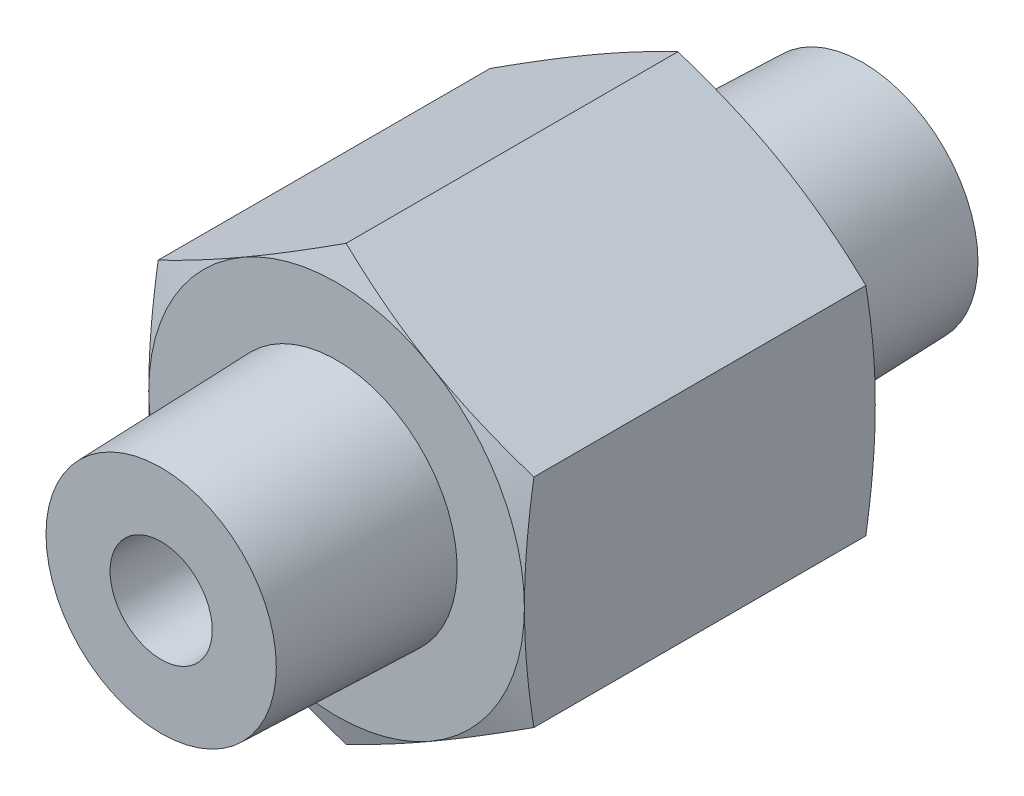
ISO-10303-21;
HEADER;
FILE_DESCRIPTION(('STEP AP214'),'2;1');
FILE_NAME('part.step','',(''),(''),'','','');
FILE_SCHEMA(('AUTOMOTIVE_DESIGN { 1 0 10303 214 1 1 1 1 }'));
ENDSEC;
DATA;
#1=APPLICATION_CONTEXT('core data for automotive mechanical design processes');
#2=APPLICATION_PROTOCOL_DEFINITION('international standard','automotive_design',2000,#1);
#3=PRODUCT_CONTEXT('',#1,'mechanical');
#4=PRODUCT('Part','Part','',(#3));
#5=PRODUCT_RELATED_PRODUCT_CATEGORY('part','',(#4));
#6=PRODUCT_DEFINITION_FORMATION('','',#4);
#7=PRODUCT_DEFINITION_CONTEXT('part definition',#1,'design');
#8=PRODUCT_DEFINITION('design','',#6,#7);
#9=PRODUCT_DEFINITION_SHAPE('','',#8);
#10=(LENGTH_UNIT() NAMED_UNIT(*) SI_UNIT(.MILLI.,.METRE.));
#11=(NAMED_UNIT(*) PLANE_ANGLE_UNIT() SI_UNIT($,.RADIAN.));
#12=(NAMED_UNIT(*) SI_UNIT($,.STERADIAN.) SOLID_ANGLE_UNIT());
#13=UNCERTAINTY_MEASURE_WITH_UNIT(LENGTH_MEASURE(1.E-05),#10,'distance_accuracy_value','');
#14=(GEOMETRIC_REPRESENTATION_CONTEXT(3) GLOBAL_UNCERTAINTY_ASSIGNED_CONTEXT((#13)) GLOBAL_UNIT_ASSIGNED_CONTEXT((#10,
#11,#12)) REPRESENTATION_CONTEXT('',''));
#15=CARTESIAN_POINT('',(0.,0.,0.));
#16=DIRECTION('',(0.,0.,1.));
#17=DIRECTION('',(1.,0.,0.));
#18=AXIS2_PLACEMENT_3D('',#15,#16,#17);
#19=CARTESIAN_POINT('',(-12.8328841000674,-29.5245672419469,12.3543812079475));
#20=DIRECTION('',(0.,0.,-1.));
#21=DIRECTION('',(-1.,0.,0.));
#22=AXIS2_PLACEMENT_3D('',#19,#20,#21);
#23=CONICAL_SURFACE('',#22,7.85873179252687,1.25572810838714);
#24=CARTESIAN_POINT('',(-6.03250002315519,-33.4507708460823,12.3564425605555));
#25=CARTESIAN_POINT('',(-6.31445630377184,-33.6135583805961,12.4095177181261));
#26=CARTESIAN_POINT('',(-6.59716275282195,-33.7767790250568,12.4577565961613));
#27=CARTESIAN_POINT('',(-7.16405087752652,-34.1040720364554,12.5425743642866));
#28=CARTESIAN_POINT('',(-7.44823335279292,-34.2681448650494,12.5791460727817));
#29=CARTESIAN_POINT('',(-8.01553610255554,-34.5956772603369,12.6383459393257));
#30=CARTESIAN_POINT('',(-8.29864801930982,-34.7591320016857,12.6610780220679));
#31=CARTESIAN_POINT('',(-8.86540409758653,-35.0863487760436,12.6915643882496));
#32=CARTESIAN_POINT('',(-9.1490480777702,-35.2501107043567,12.6993230814997));
#33=CARTESIAN_POINT('',(-9.71633603812726,-35.5776345609769,12.6993230812128));
#34=CARTESIAN_POINT('',(-9.99998001830064,-35.741396489284,12.691564387676));
#35=CARTESIAN_POINT('',(-10.5667360965466,-36.0686132636242,12.661078020941));
#36=CARTESIAN_POINT('',(-10.8498480132804,-36.2320680049612,12.6383459379322));
#37=CARTESIAN_POINT('',(-11.417150762996,-36.5596004002215,12.579146070887));
#38=CARTESIAN_POINT('',(-11.7013332382358,-36.7236732288002,12.5425743621575));
#39=CARTESIAN_POINT('',(-12.2682213628835,-37.050966240166,12.4577565936016));
#40=CARTESIAN_POINT('',(-12.5509278119034,-37.2141868846092,12.4095177153702));
#41=CARTESIAN_POINT('',(-12.8328840924905,-37.3769744191059,12.3564425576241));
#42=B_SPLINE_CURVE_WITH_KNOTS('',3,(#24,#25,#26,#27,#28,#29,#30,#31,#32,#33,#34,#35,#36,#37,#38,
#39,#40,#41),.UNSPECIFIED.,.F.,.F.,(4,2,2,2,2,2,2,2,4),(0.,0.989698202305701,1.98000443202009,
2.96277944541265,3.94526497769435,4.92775050996127,5.91052552333983,6.90083175304187,
7.89052995533144),.UNSPECIFIED.);
#43=CARTESIAN_POINT('',(-6.03250001157758,-33.4507708503758,12.356442556588));
#44=VERTEX_POINT('',#43);
#45=CARTESIAN_POINT('',(-12.8328840853952,-37.3769744269109,12.3564425550803));
#46=VERTEX_POINT('',#45);
#47=EDGE_CURVE('E20',#44,#46,#42,.T.);
#48=ORIENTED_EDGE('',*,*,#47,.F.);
#49=CARTESIAN_POINT('',(-6.03249999999997,-29.5245672419469,12.6993230813563));
#50=CARTESIAN_POINT('',(-6.03249999999997,-29.689139728194,12.6993350027685));
#51=CARTESIAN_POINT('',(-6.03249999999997,-29.8537101836406,12.6973762268927));
#52=CARTESIAN_POINT('',(-6.03249999999997,-30.1827522540147,12.689605172264));
#53=CARTESIAN_POINT('',(-6.03249999999997,-30.3472238734402,12.6837930846635));
#54=CARTESIAN_POINT('',(-6.03249999999997,-30.6757173242797,12.6684160385915));
#55=CARTESIAN_POINT('',(-6.03249999999997,-30.8397394493358,12.6588573175667));
#56=CARTESIAN_POINT('',(-6.03249999999997,-31.1675341295729,12.6361520500869));
#57=CARTESIAN_POINT('',(-6.03249999999997,-31.3313066833523,12.6230054835561));
#58=CARTESIAN_POINT('',(-6.03249999999997,-31.8220297871308,12.5784906014492));
#59=CARTESIAN_POINT('',(-6.03249999999997,-32.1485211587437,12.5420404589201));
#60=CARTESIAN_POINT('',(-6.03249999999997,-32.8005604090443,12.4574920523785));
#61=CARTESIAN_POINT('',(-6.03249999999997,-33.1261057886405,12.4093743645941));
#62=CARTESIAN_POINT('',(-6.03249999999997,-33.450770853896,12.3564425527464));
#63=B_SPLINE_CURVE_WITH_KNOTS('',3,(#49,#50,#51,#52,#53,#54,#55,#56,#57,#58,#59,#60,#61,#62),
.UNSPECIFIED.,.F.,.F.,(4,2,2,2,2,2,4),(0.,0.4937025103216,0.987380531223423,1.48024013742641,
1.97310250150981,2.95842095529439,3.94539113687642),.UNSPECIFIED.);
#64=CARTESIAN_POINT('',(-6.03353845914368,-29.5245672419469,12.6996615408672));
#65=VERTEX_POINT('',#64);
#66=EDGE_CURVE('E83',#65,#44,#63,.T.);
#67=ORIENTED_EDGE('',*,*,#66,.F.);
#68=CARTESIAN_POINT('',(-12.8328841000674,-29.5245672419469,12.7000000007563));
#69=DIRECTION('',(0.,0.,-1.));
#70=DIRECTION('',(-1.,0.,0.));
#71=AXIS2_PLACEMENT_3D('',#68,#69,#70);
#72=CIRCLE('',#71,6.79830718178003);
#73=CARTESIAN_POINT('',(-19.6322297409911,-29.5245672419469,12.6996615408672));
#74=VERTEX_POINT('',#73);
#75=EDGE_CURVE('E266',#74,#65,#72,.F.);
#76=ORIENTED_EDGE('',*,*,#75,.F.);
#77=CARTESIAN_POINT('',(-19.6332682001348,-33.4507707990202,12.3564425616891));
#78=CARTESIAN_POINT('',(-19.6332682001348,-33.126105738253,12.4093743722521));
#79=CARTESIAN_POINT('',(-19.6332682001348,-32.8005603631703,12.4574920588276));
#80=CARTESIAN_POINT('',(-19.6332682001348,-32.1485211219262,12.5420404631967));
#81=CARTESIAN_POINT('',(-19.6332682001348,-31.8220297548562,12.5784906047615));
#82=CARTESIAN_POINT('',(-19.6332682001348,-31.3313066579307,12.6230054856694));
#83=CARTESIAN_POINT('',(-19.6332682001348,-31.167534106444,12.6361520518417));
#84=CARTESIAN_POINT('',(-19.6332682001348,-30.8397394308021,12.6588573186978));
#85=CARTESIAN_POINT('',(-19.6332682001348,-30.6757173080485,12.6684160394575));
#86=CARTESIAN_POINT('',(-19.6332682001348,-30.3472238618306,12.6837930851007));
#87=CARTESIAN_POINT('',(-19.6332682001348,-30.1827522447244,12.6896051725379));
#88=CARTESIAN_POINT('',(-19.6332682001348,-29.8537101789932,12.6973762269477));
#89=CARTESIAN_POINT('',(-19.6332682001348,-29.6891397258703,12.6993350027679));
#90=CARTESIAN_POINT('',(-19.6332682001348,-29.5245672419469,12.6993230813563));
#91=B_SPLINE_CURVE_WITH_KNOTS('',3,(#77,#78,#79,#80,#81,#82,#83,#84,#85,#86,#87,#88,#89,#90),
.UNSPECIFIED.,.F.,.F.,(4,2,2,2,2,2,4),(0.,0.986970167665906,1.97228860759221,2.4651509647349,
2.95801056399747,3.45168857793044,3.94539108128145),.UNSPECIFIED.);
#92=CARTESIAN_POINT('',(-19.6332682096418,-33.4507708391262,12.3564425524699));
#93=VERTEX_POINT('',#92);
#94=EDGE_CURVE('E120',#93,#74,#91,.T.);
#95=ORIENTED_EDGE('',*,*,#94,.F.);
#96=CARTESIAN_POINT('',(-12.8328840866695,-37.3769744312157,12.3564425536772));
#97=CARTESIAN_POINT('',(-13.1148403697725,-37.2141868952665,12.4095177121419));
#98=CARTESIAN_POINT('',(-13.3975468213224,-37.0509662493625,12.4577565910307));
#99=CARTESIAN_POINT('',(-13.9644349510619,-36.723673235057,12.5425743607232));
#100=CARTESIAN_POINT('',(-14.2486174288636,-36.5596004049992,12.5791460699316));
#101=CARTESIAN_POINT('',(-14.8159201836731,-36.2320680067979,12.6383459376914));
#102=CARTESIAN_POINT('',(-15.0990321029387,-36.0686132639991,12.6610780209393));
#103=CARTESIAN_POINT('',(-15.6657881862551,-35.7413964867316,12.6915643878806));
#104=CARTESIAN_POINT('',(-15.9494321689671,-35.5776345569588,12.6993230813849));
#105=CARTESIAN_POINT('',(-16.516720134389,-35.2501106974144,12.6993230813277));
#106=CARTESIAN_POINT('',(-16.8003641170989,-35.0863487676428,12.6915643877663));
#107=CARTESIAN_POINT('',(-17.3671202004092,-34.7591319903788,12.6610780207147));
#108=CARTESIAN_POINT('',(-17.6502321196707,-34.5956772475824,12.6383459374138));
#109=CARTESIAN_POINT('',(-18.2175348744709,-34.2681448493865,12.5791460695541));
#110=CARTESIAN_POINT('',(-18.5017173522672,-34.1040720193318,12.542574360299));
#111=CARTESIAN_POINT('',(-19.0686054819955,-33.7767790050328,12.4577565905207));
#112=CARTESIAN_POINT('',(-19.3513119335393,-33.6135583591323,12.4095177115929));
#113=CARTESIAN_POINT('',(-19.6332682166365,-33.4507708231864,12.3564425530932));
#114=B_SPLINE_CURVE_WITH_KNOTS('',3,(#96,#97,#98,#99,#100,#101,#102,#103,#104,#105,#106,#107,
#108,#109,#110,#111,#112,#113),.UNSPECIFIED.,.F.,.F.,(4,2,2,2,2,2,2,2,4),(0.,0.989698211241575,
1.98000444991756,2.96277947208654,3.94526501313271,4.92775055417593,5.91052557634213,
6.90083181501565,7.89053002625402),.UNSPECIFIED.);
#115=EDGE_CURVE('E98',#46,#93,#114,.T.);
#116=ORIENTED_EDGE('',*,*,#115,.F.);
#117=EDGE_LOOP('',(#48,#67,#76,#95,#116));
#118=FACE_BOUND('',#117,.T.);
#119=ADVANCED_FACE('F16',(#118),#23,.T.);
#120=CARTESIAN_POINT('',(-12.8328841000674,-29.5245672419469,12.3543812193355));
#121=DIRECTION('',(0.,0.,-1.));
#122=DIRECTION('',(-1.,0.,0.));
#123=AXIS2_PLACEMENT_3D('',#120,#121,#122);
#124=CONICAL_SURFACE('',#123,7.85873175758641,1.25572810838714);
#125=CARTESIAN_POINT('',(-19.6332682001348,-29.5245672419469,12.6993230813563));
#126=CARTESIAN_POINT('',(-19.6332682001348,-29.3599947557268,12.6993350027685));
#127=CARTESIAN_POINT('',(-19.6332682001348,-29.1954243003073,12.6973762268934));
#128=CARTESIAN_POINT('',(-19.6332682001348,-28.8663822299873,12.6896051722672));
#129=CARTESIAN_POINT('',(-19.6332682001348,-28.7019106105888,12.6837930846686));
#130=CARTESIAN_POINT('',(-19.6332682001348,-28.373417159803,12.6684160386016));
#131=CARTESIAN_POINT('',(-19.6332682001348,-28.2093950347737,12.6588573175798));
#132=CARTESIAN_POINT('',(-19.6332682001348,-27.8816003545901,12.6361520501074));
#133=CARTESIAN_POINT('',(-19.6332682001348,-27.7178278008374,12.6230054835807));
#134=CARTESIAN_POINT('',(-19.6332682001348,-27.2271046971387,12.5784906014878));
#135=CARTESIAN_POINT('',(-19.6332682001348,-26.9006133255787,12.5420404589699));
#136=CARTESIAN_POINT('',(-19.6332682001348,-26.2485740753835,12.4574920524536));
#137=CARTESIAN_POINT('',(-19.6332682001348,-25.9230286958398,12.4093743646833));
#138=CARTESIAN_POINT('',(-19.6332682001348,-25.5983636306366,12.3564425528505));
#139=B_SPLINE_CURVE_WITH_KNOTS('',3,(#125,#126,#127,#128,#129,#130,#131,#132,#133,#134,#135,
#136,#137,#138),.UNSPECIFIED.,.F.,.F.,(4,2,2,2,2,2,4),(0.,0.493702510240456,0.987380531061167,
1.48024013718337,1.97310250118598,2.95842095480924,3.9453911362293),.UNSPECIFIED.);
#140=CARTESIAN_POINT('',(-19.6332682104417,-25.5983636461531,12.3564425524699));
#141=VERTEX_POINT('',#140);
#142=EDGE_CURVE('E121',#74,#141,#139,.T.);
#143=ORIENTED_EDGE('',*,*,#142,.F.);
#144=CARTESIAN_POINT('',(-12.8328841000674,-29.5245672419469,12.7000000007563));
#145=DIRECTION('',(0.,0.,-1.));
#146=DIRECTION('',(-1.,0.,0.));
#147=AXIS2_PLACEMENT_3D('',#144,#145,#146);
#148=CIRCLE('',#147,6.79830718178003);
#149=EDGE_CURVE('E193',#65,#74,#148,.F.);
#150=ORIENTED_EDGE('',*,*,#149,.F.);
#151=CARTESIAN_POINT('',(-6.03249999999997,-25.5983636848736,12.3564425616891));
#152=CARTESIAN_POINT('',(-6.03249999999997,-25.9230287456408,12.4093743722521));
#153=CARTESIAN_POINT('',(-6.03249999999997,-26.2485741207235,12.4574920588275));
#154=CARTESIAN_POINT('',(-6.03249999999997,-26.9006133619676,12.5420404631967));
#155=CARTESIAN_POINT('',(-6.03249999999997,-27.2271047290376,12.5784906047615));
#156=CARTESIAN_POINT('',(-6.03249999999997,-27.7178278259631,12.6230054856694));
#157=CARTESIAN_POINT('',(-6.03249999999997,-27.8816003774498,12.6361520518417));
#158=CARTESIAN_POINT('',(-6.03249999999997,-28.2093950530917,12.6588573186978));
#159=CARTESIAN_POINT('',(-6.03249999999997,-28.3734171758454,12.6684160394575));
#160=CARTESIAN_POINT('',(-6.03249999999997,-28.7019106220632,12.6837930851007));
#161=CARTESIAN_POINT('',(-6.03249999999997,-28.8663822391694,12.6896051725379));
#162=CARTESIAN_POINT('',(-6.03249999999997,-29.1954243049006,12.6973762269477));
#163=CARTESIAN_POINT('',(-6.03249999999997,-29.3599947580236,12.6993350027679));
#164=CARTESIAN_POINT('',(-6.03249999999997,-29.5245672419469,12.6993230813563));
#165=B_SPLINE_CURVE_WITH_KNOTS('',3,(#151,#152,#153,#154,#155,#156,#157,#158,#159,#160,#161,
#162,#163,#164),.UNSPECIFIED.,.F.,.F.,(4,2,2,2,2,2,4),(0.,0.986970167665902,1.9722886075922,
2.4651509647349,2.95801056399746,3.45168857793043,3.94539108128144),.UNSPECIFIED.);
#166=CARTESIAN_POINT('',(-6.03249999049295,-25.5983636447676,12.3564425524699));
#167=VERTEX_POINT('',#166);
#168=EDGE_CURVE('E91',#167,#65,#165,.T.);
#169=ORIENTED_EDGE('',*,*,#168,.F.);
#170=CARTESIAN_POINT('',(-12.832884070888,-21.6721600772601,12.3564425616891));
#171=CARTESIAN_POINT('',(-12.5509277894989,-21.8349476122198,12.4095177193354));
#172=CARTESIAN_POINT('',(-12.2682213396717,-21.9981682571292,12.4577565974118));
#173=CARTESIAN_POINT('',(-11.7013332134061,-22.325461269429,12.5425743655364));
#174=CARTESIAN_POINT('',(-11.4171507373559,-22.4895340984756,12.5791460739895));
#175=CARTESIAN_POINT('',(-10.8498479860394,-22.8170664946602,12.6383459403516));
#176=CARTESIAN_POINT('',(-10.5667360685151,-22.9805212364536,12.661078022955));
#177=CARTESIAN_POINT('',(-9.99997998870439,-23.3077380116972,12.6915643887624));
#178=CARTESIAN_POINT('',(-9.71633600775668,-23.4714999404514,12.699323081777));
#179=CARTESIAN_POINT('',(-9.14904804589145,-23.7990237979423,12.6993230809355));
#180=CARTESIAN_POINT('',(-8.86540406497393,-23.962785726679,12.6915643870802));
#181=CARTESIAN_POINT('',(-8.29864798525335,-24.2900025018706,12.6610780196504));
#182=CARTESIAN_POINT('',(-8.01553606778907,-24.4534572436294,12.6383459362653));
#183=CARTESIAN_POINT('',(-7.44823331661046,-24.7809896397344,12.5791460684336));
#184=CARTESIAN_POINT('',(-7.16405084063828,-24.9450624687359,12.5425743592933));
#185=CARTESIAN_POINT('',(-6.59716271453942,-25.2723554809395,12.457756589906));
#186=CARTESIAN_POINT('',(-6.31445626480079,-25.4355761257977,12.4095177112542));
#187=CARTESIAN_POINT('',(-6.0324999834983,-25.5983636607074,12.3564425530932));
#188=B_SPLINE_CURVE_WITH_KNOTS('',3,(#170,#171,#172,#173,#174,#175,#176,#177,#178,#179,#180,
#181,#182,#183,#184,#185,#186,#187),.UNSPECIFIED.,.F.,.F.,(4,2,2,2,2,2,2,2,4),(0.,
0.989698204984056,1.98000443738037,2.96277945340149,3.94526498830903,4.92775052317326,
5.91052553915331,6.90083177151339,7.89052997645016),.UNSPECIFIED.);
#189=CARTESIAN_POINT('',(-12.8328841008673,-21.6721600489738,12.3564425524699));
#190=VERTEX_POINT('',#189);
#191=EDGE_CURVE('E112',#190,#167,#188,.T.);
#192=ORIENTED_EDGE('',*,*,#191,.F.);
#193=CARTESIAN_POINT('',(-19.6332681709554,-25.5983636343334,12.3564425616891));
#194=CARTESIAN_POINT('',(-19.3513118895663,-25.4355760993737,12.4095177193354));
#195=CARTESIAN_POINT('',(-19.0686054397391,-25.2723554544643,12.4577565974118));
#196=CARTESIAN_POINT('',(-18.5017173134735,-24.9450624421645,12.5425743655364));
#197=CARTESIAN_POINT('',(-18.2175348374233,-24.7809896131179,12.5791460739895));
#198=CARTESIAN_POINT('',(-17.6502320861068,-24.4534572169333,12.6383459403516));
#199=CARTESIAN_POINT('',(-17.3671201685826,-24.2900024751399,12.661078022955));
#200=CARTESIAN_POINT('',(-16.8003640887718,-23.9627856998963,12.6915643887624));
#201=CARTESIAN_POINT('',(-16.5167201078241,-23.7990237711421,12.699323081777));
#202=CARTESIAN_POINT('',(-15.9494321459589,-23.4714999136512,12.6993230809355));
#203=CARTESIAN_POINT('',(-15.6657881650413,-23.3077379849144,12.6915643870802));
#204=CARTESIAN_POINT('',(-15.0990320853208,-22.9805212097229,12.6610780196504));
#205=CARTESIAN_POINT('',(-14.8159201678565,-22.8170664679641,12.6383459362653));
#206=CARTESIAN_POINT('',(-14.2486174166779,-22.4895340718591,12.5791460684336));
#207=CARTESIAN_POINT('',(-13.9644349407057,-22.3254612428576,12.5425743592933));
#208=CARTESIAN_POINT('',(-13.3975468146068,-21.998168230654,12.457756589906));
#209=CARTESIAN_POINT('',(-13.1148403648682,-21.8349475857958,12.4095177112542));
#210=CARTESIAN_POINT('',(-12.8328840835657,-21.6721600508861,12.3564425530932));
#211=B_SPLINE_CURVE_WITH_KNOTS('',3,(#193,#194,#195,#196,#197,#198,#199,#200,#201,#202,#203,
#204,#205,#206,#207,#208,#209,#210),.UNSPECIFIED.,.F.,.F.,(4,2,2,2,2,2,2,2,4),(0.,
0.989698204984053,1.98000443738036,2.96277945340147,3.94526498830901,4.92775052317323,
5.91052553915329,6.90083177151336,7.89052997645012),.UNSPECIFIED.);
#212=EDGE_CURVE('E116',#141,#190,#211,.T.);
#213=ORIENTED_EDGE('',*,*,#212,.F.);
#214=EDGE_LOOP('',(#143,#150,#169,#192,#213));
#215=FACE_BOUND('',#214,.T.);
#216=ADVANCED_FACE('F236',(#215),#124,.T.);
#217=CARTESIAN_POINT('',(-6.03249999999997,-33.4507708327137,0.));
#218=DIRECTION('',(0.5,-0.866025403784439,0.));
#219=DIRECTION('',(0.866025403784439,0.5,0.));
#220=AXIS2_PLACEMENT_3D('',#217,#218,#219);
#221=PLANE('',#220);
#222=CARTESIAN_POINT('',(-6.0324999707416,-33.4507708158213,0.343557449307297));
#223=CARTESIAN_POINT('',(-6.31445624908692,-33.6135583490237,0.290482291555843));
#224=CARTESIAN_POINT('',(-6.59716269585053,-33.7767789921643,0.242243413194673));
#225=CARTESIAN_POINT('',(-7.16405081597139,-34.1040720009165,0.157425644093838));
#226=CARTESIAN_POINT('',(-7.44823328894055,-34.2681448281842,0.120853934949022));
#227=CARTESIAN_POINT('',(-8.01553603416193,-34.5956772208498,0.0616540667526662));
#228=CARTESIAN_POINT('',(-8.29864794867222,-34.7591319609031,0.0389219830118113));
#229=CARTESIAN_POINT('',(-8.86540402250106,-35.086348732693,0.00843561451084385));
#230=CARTESIAN_POINT('',(-9.14904800048083,-35.2501106597337,0.000676919940296011));
#231=CARTESIAN_POINT('',(-9.71633595653336,-35.5776345138686,0.000676917347173867));
#232=CARTESIAN_POINT('',(-9.99997993460613,-35.741396440963,0.0084356093267082));
#233=CARTESIAN_POINT('',(-10.5667360087129,-36.0686132129133,0.0389219728278182));
#234=CARTESIAN_POINT('',(-10.8498479234081,-36.2320679530734,0.0616540541597762));
#235=CARTESIAN_POINT('',(-11.4171506690544,-36.5596003459843,0.120853917827179));
#236=CARTESIAN_POINT('',(-11.701333142264,-36.7236731733909,0.157425624854077));
#237=CARTESIAN_POINT('',(-12.2682212628985,-37.0509661824396,0.242243390063684));
#238=CARTESIAN_POINT('',(-12.5509277099353,-37.214186825738,0.290482266651737));
#239=CARTESIAN_POINT('',(-12.8328839885475,-37.3769743590944,0.343557422816645));
#240=B_SPLINE_CURVE_WITH_KNOTS('',3,(#222,#223,#224,#225,#226,#227,#228,#229,#230,#231,#232,
#233,#234,#235,#236,#237,#238,#239),.UNSPECIFIED.,.F.,.F.,(4,2,2,2,2,2,2,2,4),(0.,
0.989698194624882,1.98000441665682,2.96277942251545,3.94526494726926,4.92775047215657,
5.91052547814175,6.90083170028534,7.89052989505597),.UNSPECIFIED.);
#241=CARTESIAN_POINT('',(-6.03249999999997,-33.4507708063908,0.343557439512035));
#242=VERTEX_POINT('',#241);
#243=CARTESIAN_POINT('',(-12.8328840340005,-37.3769743972381,0.343557435248635));
#244=VERTEX_POINT('',#243);
#245=EDGE_CURVE('E104',#242,#244,#240,.T.);
#246=ORIENTED_EDGE('',*,*,#245,.F.);
#247=DIRECTION('',(0.,0.,-1.));
#248=VECTOR('',#247,1.);
#249=CARTESIAN_POINT('',(-6.03249999999997,-33.4507708565165,0.));
#250=LINE('',#249,#248);
#251=EDGE_CURVE('E89',#44,#242,#250,.T.);
#252=ORIENTED_EDGE('',*,*,#251,.F.);
#253=ORIENTED_EDGE('',*,*,#47,.T.);
#254=DIRECTION('',(0.,0.,1.));
#255=VECTOR('',#254,1.);
#256=CARTESIAN_POINT('',(-12.8328840794535,-37.3769744353819,0.));
#257=LINE('',#256,#255);
#258=EDGE_CURVE('E122',#244,#46,#257,.T.);
#259=ORIENTED_EDGE('',*,*,#258,.F.);
#260=EDGE_LOOP('',(#246,#252,#253,#259));
#261=FACE_BOUND('',#260,.T.);
#262=ADVANCED_FACE('F103',(#261),#221,.T.);
#263=CARTESIAN_POINT('',(-12.8328841000674,-37.3769744234804,0.));
#264=DIRECTION('',(-0.5,-0.866025403784439,0.));
#265=DIRECTION('',(0.866025403784439,-0.5,0.));
#266=AXIS2_PLACEMENT_3D('',#263,#264,#265);
#267=PLANE('',#266);
#268=CARTESIAN_POINT('',(-12.8328840228453,-37.3769744087988,0.343557492999597));
#269=CARTESIAN_POINT('',(-13.1148403160481,-37.2141869050012,0.290482309917699));
#270=CARTESIAN_POINT('',(-13.3975467698301,-37.0509662733886,0.242243420826713));
#271=CARTESIAN_POINT('',(-13.9644348968989,-36.7236732720345,0.15742564322755));
#272=CARTESIAN_POINT('',(-14.2486173697925,-36.5596004406276,0.120853936314349));
#273=CARTESIAN_POINT('',(-14.8159201164625,-36.23206804409,0.0616540692418723));
#274=CARTESIAN_POINT('',(-15.0990320324818,-36.0686133042724,0.0389219844055949));
#275=CARTESIAN_POINT('',(-15.6657881089344,-35.7413965317777,0.00843561472536749));
#276=CARTESIAN_POINT('',(-15.9494320880293,-35.5776346037968,0.000676920075063905));
#277=CARTESIAN_POINT('',(-16.5167200460691,-35.2501107482974,0.000676917212393507));
#278=CARTESIAN_POINT('',(-16.800364025014,-35.0863488207788,0.00843560898117262));
#279=CARTESIAN_POINT('',(-17.3671201007728,-34.7591320479331,0.0389219722228184));
#280=CARTESIAN_POINT('',(-17.6502320162481,-34.5956773073018,0.061654053502977));
#281=CARTESIAN_POINT('',(-18.2175347637127,-34.2681449133243,0.120853917164493));
#282=CARTESIAN_POINT('',(-18.5017172379597,-34.104072085323,0.157425624249758));
#283=CARTESIAN_POINT('',(-19.0686053607469,-33.7767790750398,0.242243389681755));
#284=CARTESIAN_POINT('',(-19.3513118088987,-33.613558431102,0.290482266437379));
#285=CARTESIAN_POINT('',(-19.6332680886149,-33.4507708970997,0.343557422816635));
#286=B_SPLINE_CURVE_WITH_KNOTS('',3,(#268,#269,#270,#271,#272,#273,#274,#275,#276,#277,#278,
#279,#280,#281,#282,#283,#284,#285),.UNSPECIFIED.,.F.,.F.,(4,2,2,2,2,2,2,2,4),(0.,
0.989698200229331,1.98000442720709,2.96277943701576,3.94526496600607,4.92775049380262,
5.91052550249186,6.90083172821924,7.89052992687679),.UNSPECIFIED.);
#287=CARTESIAN_POINT('',(-19.6332681443748,-33.4507708768081,0.343557435248631));
#288=VERTEX_POINT('',#287);
#289=EDGE_CURVE('E212',#244,#288,#286,.T.);
#290=ORIENTED_EDGE('',*,*,#289,.F.);
#291=ORIENTED_EDGE('',*,*,#258,.T.);
#292=ORIENTED_EDGE('',*,*,#115,.T.);
#293=DIRECTION('',(0.,0.,1.));
#294=VECTOR('',#293,1.);
#295=CARTESIAN_POINT('',(-19.6332682001348,-33.4507708565165,0.));
#296=LINE('',#295,#294);
#297=EDGE_CURVE('E117',#288,#93,#296,.T.);
#298=ORIENTED_EDGE('',*,*,#297,.F.);
#299=EDGE_LOOP('',(#290,#291,#292,#298));
#300=FACE_BOUND('',#299,.T.);
#301=ADVANCED_FACE('F218',(#300),#267,.T.);
#302=CARTESIAN_POINT('',(-19.6332682001348,-33.4507708327137,0.));
#303=DIRECTION('',(-1.,0.,0.));
#304=DIRECTION('',(0.,0.,1.));
#305=AXIS2_PLACEMENT_3D('',#302,#303,#304);
#306=PLANE('',#305);
#307=ORIENTED_EDGE('',*,*,#297,.T.);
#308=ORIENTED_EDGE('',*,*,#94,.T.);
#309=ORIENTED_EDGE('',*,*,#142,.T.);
#310=DIRECTION('',(0.,0.,1.));
#311=VECTOR('',#310,1.);
#312=CARTESIAN_POINT('',(-19.6332682207487,-25.5983636630816,0.));
#313=LINE('',#312,#311);
#314=CARTESIAN_POINT('',(-19.6332682104417,-25.5983637215341,0.343557435245831));
#315=VERTEX_POINT('',#314);
#316=EDGE_CURVE('E113',#315,#141,#313,.T.);
#317=ORIENTED_EDGE('',*,*,#316,.F.);
#318=CARTESIAN_POINT('',(-19.6332682001348,-29.5245672419469,0.000676918643727223));
#319=CARTESIAN_POINT('',(-19.6332682001348,-29.3599947620512,0.000664997233267309));
#320=CARTESIAN_POINT('',(-19.6332682001348,-29.1954243129557,0.00262377295703875));
#321=CARTESIAN_POINT('',(-19.6332682001348,-28.8663822552717,0.0103948269873144));
#322=CARTESIAN_POINT('',(-19.6332682001348,-28.7019106421854,0.016206914141444));
#323=CARTESIAN_POINT('',(-19.6332682001348,-28.3734172039781,0.0315839590415283));
#324=CARTESIAN_POINT('',(-19.6332682001348,-28.2093950852152,0.0411426793417016));
#325=CARTESIAN_POINT('',(-19.6332682001348,-27.8816004175379,0.06384794511679));
#326=CARTESIAN_POINT('',(-19.6332682001348,-27.717827870025,0.0769945106676919));
#327=CARTESIAN_POINT('',(-19.6332682001348,-27.2271047849774,0.121509389497483));
#328=CARTESIAN_POINT('',(-19.6332682001348,-26.9006134257813,0.157959529390901));
#329=CARTESIAN_POINT('',(-19.6332682001348,-26.2485742002344,0.242507929994696));
#330=CARTESIAN_POINT('',(-19.6332682001348,-25.9230288329747,0.290625614474715));
#331=CARTESIAN_POINT('',(-19.6332682001348,-25.5983637799866,0.34355742281103));
#332=B_SPLINE_CURVE_WITH_KNOTS('',3,(#318,#319,#320,#321,#322,#323,#324,#325,#326,#327,#328,
#329,#330,#331),.UNSPECIFIED.,.F.,.F.,(4,2,2,2,2,2,4),(0.,0.49370249126929,0.987380493123536,
1.48024008035665,1.97310242546942,2.95842084137593,3.94539098492179),.UNSPECIFIED.);
#333=CARTESIAN_POINT('',(-19.6322297409911,-29.5245672419469,0.000338459132797844));
#334=VERTEX_POINT('',#333);
#335=EDGE_CURVE('E279',#334,#315,#332,.T.);
#336=ORIENTED_EDGE('',*,*,#335,.F.);
#337=CARTESIAN_POINT('',(-19.633268148809,-33.4507708922492,0.343557492999605));
#338=CARTESIAN_POINT('',(-19.6332681821782,-33.1261058267903,0.290625654996818));
#339=CARTESIAN_POINT('',(-19.633268195434,-32.8005604447496,0.242507956242508));
#340=CARTESIAN_POINT('',(-19.6332682048278,-32.1485211878653,0.157959540873307));
#341=CARTESIAN_POINT('',(-19.6332682009943,-31.8220298121176,0.121509400456563));
#342=CARTESIAN_POINT('',(-19.6332681997049,-31.33130670277,0.0769945183855548));
#343=CARTESIAN_POINT('',(-19.633268200019,-31.1675341473247,0.0638479513482995));
#344=CARTESIAN_POINT('',(-19.6332682002506,-30.8397394637356,0.0411426832251845));
#345=CARTESIAN_POINT('',(-19.6332682001679,-30.6757173369934,0.0315839620626511));
#346=CARTESIAN_POINT('',(-19.6332682001017,-30.3472238826573,0.0162069157089141));
#347=CARTESIAN_POINT('',(-19.6332682001182,-30.1827522614213,0.0103948279672167));
#348=CARTESIAN_POINT('',(-19.6332682001514,-29.8537101873732,0.00262377313896398));
#349=CARTESIAN_POINT('',(-19.633268200168,-29.6891397300631,0.000664997206000013));
#350=CARTESIAN_POINT('',(-19.6332682001348,-29.5245672419469,0.000676918643727199));
#351=B_SPLINE_CURVE_WITH_KNOTS('',3,(#337,#338,#339,#340,#341,#342,#343,#344,#345,#346,#347,
#348,#349,#350),.UNSPECIFIED.,.F.,.F.,(4,2,2,2,2,2,4),(0.,0.986970193611111,1.97228865871248,
2.46515102794519,2.95801063920427,3.45168866555192,3.9453911814693),.UNSPECIFIED.);
#352=EDGE_CURVE('E217',#288,#334,#351,.T.);
#353=ORIENTED_EDGE('',*,*,#352,.F.);
#354=EDGE_LOOP('',(#307,#308,#309,#317,#336,#353));
#355=FACE_BOUND('',#354,.T.);
#356=ADVANCED_FACE('F221',(#355),#306,.T.);
#357=CARTESIAN_POINT('',(-19.6332682001348,-25.5983636511801,0.));
#358=DIRECTION('',(-0.500000000000001,0.866025403784438,0.));
#359=DIRECTION('',(-0.866025403784438,-0.500000000000001,0.));
#360=AXIS2_PLACEMENT_3D('',#357,#358,#359);
#361=PLANE('',#360);
#362=CARTESIAN_POINT('',(-19.6332682260359,-25.5983637254172,0.343557493013369));
#363=CARTESIAN_POINT('',(-19.3513119657321,-25.4355761646373,0.290482309924003));
#364=CARTESIAN_POINT('',(-19.0686055254446,-25.272355509651,0.242243420829791));
#365=CARTESIAN_POINT('',(-18.5017174082571,-24.9450624911797,0.157425643227949));
#366=CARTESIAN_POINT('',(-18.2175349317398,-24.7809896660475,0.120853936315295));
#367=CARTESIAN_POINT('',(-17.6502321824391,-24.4534572740632,0.0616540692429585));
#368=CARTESIAN_POINT('',(-17.3671202673781,-24.2900025325847,0.0389219844062768));
#369=CARTESIAN_POINT('',(-16.800364191626,-23.9627857588741,0.00843561472555581));
#370=CARTESIAN_POINT('',(-16.5167202122737,-23.7990238313375,0.000676920075164113));
#371=CARTESIAN_POINT('',(-15.9494322540448,-23.4714999761632,0.000676917212311405));
#372=CARTESIAN_POINT('',(-15.6657882751681,-23.3077380485254,0.00843560898099041));
#373=CARTESIAN_POINT('',(-15.099032199459,-22.9805212755914,0.0389219722225114));
#374=CARTESIAN_POINT('',(-14.8159202839652,-22.8170665349911,0.0616540535026445));
#375=CARTESIAN_POINT('',(-14.248617536485,-22.4895341410382,0.120853917164164));
#376=CARTESIAN_POINT('',(-13.9644350622411,-22.3254613130303,0.157425624249461));
#377=CARTESIAN_POINT('',(-13.39754693946,-21.9981683027338,0.242243389681576));
#378=CARTESIAN_POINT('',(-13.1148404913114,-21.8349476587893,0.290482266437286));
#379=CARTESIAN_POINT('',(-12.8328842115873,-21.6721601247994,0.343557422816651));
#380=B_SPLINE_CURVE_WITH_KNOTS('',3,(#362,#363,#364,#365,#366,#367,#368,#369,#370,#371,#372,
#373,#374,#375,#376,#377,#378,#379),.UNSPECIFIED.,.F.,.F.,(4,2,2,2,2,2,2,2,4),(0.,
0.989698200231797,1.98000442721184,2.96277943702249,3.94526496601484,4.92775049381308,
5.91052550250393,6.9008317282332,7.89052992689273),.UNSPECIFIED.);
#381=CARTESIAN_POINT('',(-12.8328841661343,-21.6721600866557,0.343557435248643));
#382=VERTEX_POINT('',#381);
#383=EDGE_CURVE('E280',#315,#382,#380,.T.);
#384=ORIENTED_EDGE('',*,*,#383,.F.);
#385=ORIENTED_EDGE('',*,*,#316,.T.);
#386=ORIENTED_EDGE('',*,*,#212,.T.);
#387=DIRECTION('',(0.,0.,1.));
#388=VECTOR('',#387,1.);
#389=CARTESIAN_POINT('',(-12.8328841206813,-21.6721600485119,0.));
#390=LINE('',#389,#388);
#391=EDGE_CURVE('E93',#382,#190,#390,.T.);
#392=ORIENTED_EDGE('',*,*,#391,.F.);
#393=EDGE_LOOP('',(#384,#385,#386,#392));
#394=FACE_BOUND('',#393,.T.);
#395=ADVANCED_FACE('F290',(#394),#361,.T.);
#396=CARTESIAN_POINT('',(-12.8328841000674,-21.6721600604134,0.));
#397=DIRECTION('',(0.499999999999999,0.866025403784439,0.));
#398=DIRECTION('',(-0.866025403784439,0.499999999999999,0.));
#399=AXIS2_PLACEMENT_3D('',#396,#397,#398);
#400=PLANE('',#399);
#401=CARTESIAN_POINT('',(-12.8328841772896,-21.672160075095,0.343557492999609));
#402=CARTESIAN_POINT('',(-12.5509278840867,-21.8349475788926,0.290482309917711));
#403=CARTESIAN_POINT('',(-12.2682214303047,-21.9981682105051,0.242243420826724));
#404=CARTESIAN_POINT('',(-11.701333303236,-22.3254612118593,0.15742564322756));
#405=CARTESIAN_POINT('',(-11.4171508303424,-22.4895340432662,0.120853936314359));
#406=CARTESIAN_POINT('',(-10.8498480836723,-22.8170664398038,0.0616540692418816));
#407=CARTESIAN_POINT('',(-10.566736167653,-22.9805211796214,0.0389219844056042));
#408=CARTESIAN_POINT('',(-9.99998009120041,-23.3077379521161,0.00843561472537721));
#409=CARTESIAN_POINT('',(-9.71633611210548,-23.471499880097,0.000676920075073887));
#410=CARTESIAN_POINT('',(-9.14904815406567,-23.7990237355964,0.000676917212404126));
#411=CARTESIAN_POINT('',(-8.86540417512079,-23.962785663115,0.0084356089811838));
#412=CARTESIAN_POINT('',(-8.298648099362,-24.2900024359607,0.0389219722228306));
#413=CARTESIAN_POINT('',(-8.01553618388672,-24.453457176592,0.0616540535029897));
#414=CARTESIAN_POINT('',(-7.44823343642209,-24.7809895705695,0.120853917164507));
#415=CARTESIAN_POINT('',(-7.16405096217511,-24.9450623985708,0.157425624249773));
#416=CARTESIAN_POINT('',(-6.59716283938784,-25.272355408854,0.24224338968177));
#417=CARTESIAN_POINT('',(-6.31445639123607,-25.4355760527918,0.290482266437395));
#418=CARTESIAN_POINT('',(-6.03250011151989,-25.5983635867941,0.343557422816652));
#419=B_SPLINE_CURVE_WITH_KNOTS('',3,(#401,#402,#403,#404,#405,#406,#407,#408,#409,#410,#411,
#412,#413,#414,#415,#416,#417,#418),.UNSPECIFIED.,.F.,.F.,(4,2,2,2,2,2,2,2,4),(0.,
0.989698200229339,1.9800044272071,2.96277943701579,3.94526496600609,4.92775049380266,
5.9105255024919,6.90083172821928,7.89052992687684),.UNSPECIFIED.);
#420=CARTESIAN_POINT('',(-6.03250005575993,-25.5983636070857,0.343557435248648));
#421=VERTEX_POINT('',#420);
#422=EDGE_CURVE('E150',#382,#421,#419,.T.);
#423=ORIENTED_EDGE('',*,*,#422,.F.);
#424=ORIENTED_EDGE('',*,*,#391,.T.);
#425=ORIENTED_EDGE('',*,*,#191,.T.);
#426=DIRECTION('',(0.,0.,-1.));
#427=VECTOR('',#426,1.);
#428=CARTESIAN_POINT('',(-6.03249999999997,-25.5983636273773,0.));
#429=LINE('',#428,#427);
#430=EDGE_CURVE('E105',#421,#167,#429,.F.);
#431=ORIENTED_EDGE('',*,*,#430,.F.);
#432=EDGE_LOOP('',(#423,#424,#425,#431));
#433=FACE_BOUND('',#432,.T.);
#434=ADVANCED_FACE('F171',(#433),#400,.T.);
#435=CARTESIAN_POINT('',(-6.03249999999997,-25.5983636511801,0.));
#436=DIRECTION('',(1.,0.,0.));
#437=DIRECTION('',(0.,0.,-1.));
#438=AXIS2_PLACEMENT_3D('',#435,#436,#437);
#439=PLANE('',#438);
#440=ORIENTED_EDGE('',*,*,#430,.T.);
#441=ORIENTED_EDGE('',*,*,#168,.T.);
#442=ORIENTED_EDGE('',*,*,#66,.T.);
#443=ORIENTED_EDGE('',*,*,#251,.T.);
#444=CARTESIAN_POINT('',(-6.03249999999997,-29.5245672419469,0.000676918643745544));
#445=CARTESIAN_POINT('',(-6.03249999999997,-29.6891397240598,0.000664997232649742));
#446=CARTESIAN_POINT('',(-6.03249999999997,-29.8537101753723,0.00262377300950634));
#447=CARTESIAN_POINT('',(-6.03249999999997,-30.1827522374861,0.0103948272486937));
#448=CARTESIAN_POINT('',(-6.03249999999997,-30.3472238527853,0.0162069145586344));
#449=CARTESIAN_POINT('',(-6.03249999999997,-30.6757172954023,0.0315839598677927));
#450=CARTESIAN_POINT('',(-6.03249999999997,-30.839739416362,0.0411426804209439));
#451=CARTESIAN_POINT('',(-6.03249999999997,-31.1675340884237,0.0638479467910879));
#452=CARTESIAN_POINT('',(-6.03249999999997,-31.3313066381241,0.0769945126840695));
#453=CARTESIAN_POINT('',(-6.03249999999997,-31.8220297297102,0.12150939265782));
#454=CARTESIAN_POINT('',(-6.03249999999997,-32.1485210932408,0.157959533471292));
#455=CARTESIAN_POINT('',(-6.03249999999997,-32.8005603274287,0.242507936147853));
#456=CARTESIAN_POINT('',(-6.03249999999997,-33.1261056989948,0.290625621781357));
#457=CARTESIAN_POINT('',(-6.03249999999997,-33.4507707562652,0.343557431343432));
#458=B_SPLINE_CURVE_WITH_KNOTS('',3,(#444,#445,#446,#447,#448,#449,#450,#451,#452,#453,#454,
#455,#456,#457),.UNSPECIFIED.,.F.,.F.,(4,2,2,2,2,2,4),(0.,0.493702497920058,0.987380506423417,
1.48024010027852,1.97310245201355,2.9584208811425,3.94539103796601),.UNSPECIFIED.);
#459=CARTESIAN_POINT('',(-6.03353845914368,-29.5245672419469,0.000338459132808307));
#460=VERTEX_POINT('',#459);
#461=EDGE_CURVE('E191',#460,#242,#458,.T.);
#462=ORIENTED_EDGE('',*,*,#461,.F.);
#463=CARTESIAN_POINT('',(-6.03250005132574,-25.5983635916446,0.343557492999624));
#464=CARTESIAN_POINT('',(-6.03250001795662,-25.9230286571036,0.290625654996837));
#465=CARTESIAN_POINT('',(-6.03250000470079,-26.2485740391442,0.242507956242526));
#466=CARTESIAN_POINT('',(-6.03249999530702,-26.9006132960285,0.157959540873324));
#467=CARTESIAN_POINT('',(-6.03249999914047,-27.2271046717762,0.12150940045658));
#468=CARTESIAN_POINT('',(-6.0325000004299,-27.7178277811238,0.0769945183855725));
#469=CARTESIAN_POINT('',(-6.03250000011573,-27.8816003365691,0.0638479513483177));
#470=CARTESIAN_POINT('',(-6.03249999988422,-28.2093950201583,0.0411426832252027));
#471=CARTESIAN_POINT('',(-6.03249999996688,-28.3734171469005,0.0315839620626691));
#472=CARTESIAN_POINT('',(-6.03250000003313,-28.7019106012365,0.016206915708932));
#473=CARTESIAN_POINT('',(-6.03250000001655,-28.8663822224725,0.0103948279672348));
#474=CARTESIAN_POINT('',(-6.0324999999834,-29.1954242965206,0.00262377313898236));
#475=CARTESIAN_POINT('',(-6.03249999996682,-29.3599947538307,0.000664997206018526));
#476=CARTESIAN_POINT('',(-6.03249999999997,-29.5245672419469,0.000676918643745625));
#477=B_SPLINE_CURVE_WITH_KNOTS('',3,(#463,#464,#465,#466,#467,#468,#469,#470,#471,#472,#473,
#474,#475,#476),.UNSPECIFIED.,.F.,.F.,(4,2,2,2,2,2,4),(0.,0.986970193611111,1.97228865871248,
2.4651510279452,2.95801063920427,3.45168866555193,3.94539118146932),.UNSPECIFIED.);
#478=EDGE_CURVE('E147',#421,#460,#477,.T.);
#479=ORIENTED_EDGE('',*,*,#478,.F.);
#480=EDGE_LOOP('',(#440,#441,#442,#443,#462,#479));
#481=FACE_BOUND('',#480,.T.);
#482=ADVANCED_FACE('F86',(#481),#439,.T.);
#483=CARTESIAN_POINT('',(-12.8328841000674,-29.5245672419469,12.7));
#484=DIRECTION('',(0.,0.,1.));
#485=DIRECTION('',(1.,0.,0.));
#486=AXIS2_PLACEMENT_3D('',#483,#484,#485);
#487=PLANE('',#486);
#488=ORIENTED_EDGE('',*,*,#75,.T.);
#489=ORIENTED_EDGE('',*,*,#149,.T.);
#490=EDGE_LOOP('',(#488,#489));
#491=FACE_BOUND('',#490,.T.);
#492=CARTESIAN_POINT('',(-12.8328841000674,-29.5245672419469,12.6999999999953));
#493=DIRECTION('',(0.,0.,-1.));
#494=DIRECTION('',(-1.,0.,0.));
#495=AXIS2_PLACEMENT_3D('',#492,#493,#494);
#496=CIRCLE('',#495,4.36562388906116);
#497=CARTESIAN_POINT('',(-17.1985079891286,-29.5245672419469,12.6999999999953));
#498=VERTEX_POINT('',#497);
#499=EDGE_CURVE('E142',#498,#498,#496,.F.);
#500=ORIENTED_EDGE('',*,*,#499,.F.);
#501=EDGE_LOOP('',(#500));
#502=FACE_BOUND('',#501,.T.);
#503=ADVANCED_FACE('F170',(#491,#502),#487,.T.);
#504=CARTESIAN_POINT('',(-12.8328841000674,-29.5245672419469,0.345618792052503));
#505=DIRECTION('',(0.,0.,1.));
#506=DIRECTION('',(1.,0.,0.));
#507=AXIS2_PLACEMENT_3D('',#504,#505,#506);
#508=CONICAL_SURFACE('',#507,7.85873179252691,1.25572810838714);
#509=ORIENTED_EDGE('',*,*,#289,.T.);
#510=ORIENTED_EDGE('',*,*,#352,.T.);
#511=CARTESIAN_POINT('',(-12.8328841000674,-29.5245672419469,-7.56258879304472E-10));
#512=DIRECTION('',(0.,0.,1.));
#513=DIRECTION('',(1.,0.,0.));
#514=AXIS2_PLACEMENT_3D('',#511,#512,#513);
#515=CIRCLE('',#514,6.79830718178003);
#516=EDGE_CURVE('E39',#334,#460,#515,.T.);
#517=ORIENTED_EDGE('',*,*,#516,.T.);
#518=ORIENTED_EDGE('',*,*,#461,.T.);
#519=ORIENTED_EDGE('',*,*,#245,.T.);
#520=EDGE_LOOP('',(#509,#510,#517,#518,#519));
#521=FACE_BOUND('',#520,.T.);
#522=ADVANCED_FACE('F195',(#521),#508,.T.);
#523=CARTESIAN_POINT('',(-12.8328841000674,-29.5245672419469,0.345618780664524));
#524=DIRECTION('',(0.,0.,1.));
#525=DIRECTION('',(1.,0.,0.));
#526=AXIS2_PLACEMENT_3D('',#523,#524,#525);
#527=CONICAL_SURFACE('',#526,7.85873175758641,1.25572810838714);
#528=ORIENTED_EDGE('',*,*,#478,.T.);
#529=CARTESIAN_POINT('',(-12.8328841000674,-29.5245672419469,-7.56258770884255E-10));
#530=DIRECTION('',(0.,0.,1.));
#531=DIRECTION('',(1.,0.,0.));
#532=AXIS2_PLACEMENT_3D('',#529,#530,#531);
#533=CIRCLE('',#532,6.79830718178003);
#534=EDGE_CURVE('E136',#460,#334,#533,.T.);
#535=ORIENTED_EDGE('',*,*,#534,.T.);
#536=ORIENTED_EDGE('',*,*,#335,.T.);
#537=ORIENTED_EDGE('',*,*,#383,.T.);
#538=ORIENTED_EDGE('',*,*,#422,.T.);
#539=EDGE_LOOP('',(#528,#535,#536,#537,#538));
#540=FACE_BOUND('',#539,.T.);
#541=ADVANCED_FACE('F163',(#540),#527,.T.);
#542=CARTESIAN_POINT('',(-12.8328841000674,-29.5245672419469,12.7000000000521));
#543=DIRECTION('',(0.,0.,-1.));
#544=DIRECTION('',(-1.,0.,0.));
#545=AXIS2_PLACEMENT_3D('',#542,#543,#544);
#546=CONICAL_SURFACE('',#545,4.36562388905939,0.0311244565152572);
#547=ORIENTED_EDGE('',*,*,#499,.T.);
#548=EDGE_LOOP('',(#547));
#549=FACE_BOUND('',#548,.T.);
#550=CARTESIAN_POINT('',(-12.8328841000674,-29.5245672419469,19.0499999999929));
#551=DIRECTION('',(0.,0.,-1.));
#552=DIRECTION('',(-1.,0.,0.));
#553=AXIS2_PLACEMENT_3D('',#550,#551,#552);
#554=CIRCLE('',#553,4.16791974530276);
#555=CARTESIAN_POINT('',(-17.0008038453702,-29.5245672419469,19.0499999999929));
#556=VERTEX_POINT('',#555);
#557=EDGE_CURVE('E133',#556,#556,#554,.T.);
#558=ORIENTED_EDGE('',*,*,#557,.T.);
#559=EDGE_LOOP('',(#558));
#560=FACE_BOUND('',#559,.T.);
#561=ADVANCED_FACE('F328',(#549,#560),#546,.T.);
#562=CARTESIAN_POINT('',(-12.8328841000674,-29.5245672419469,0.));
#563=DIRECTION('',(0.,0.,1.));
#564=DIRECTION('',(1.,0.,0.));
#565=AXIS2_PLACEMENT_3D('',#562,#563,#564);
#566=PLANE('',#565);
#567=ORIENTED_EDGE('',*,*,#516,.F.);
#568=ORIENTED_EDGE('',*,*,#534,.F.);
#569=EDGE_LOOP('',(#567,#568));
#570=FACE_BOUND('',#569,.T.);
#571=CARTESIAN_POINT('',(-12.8328841000674,-29.5245672419469,0.));
#572=DIRECTION('',(0.,0.,1.));
#573=DIRECTION('',(1.,0.,0.));
#574=AXIS2_PLACEMENT_3D('',#571,#572,#573);
#575=CIRCLE('',#574,4.36562388905778);
#576=CARTESIAN_POINT('',(-8.46726021100964,-29.5245672419469,0.));
#577=VERTEX_POINT('',#576);
#578=EDGE_CURVE('E130',#577,#577,#575,.F.);
#579=ORIENTED_EDGE('',*,*,#578,.F.);
#580=EDGE_LOOP('',(#579));
#581=FACE_BOUND('',#580,.T.);
#582=ADVANCED_FACE('F325',(#570,#581),#566,.F.);
#583=CARTESIAN_POINT('',(-12.8328841000674,-29.5245672419469,19.05));
#584=DIRECTION('',(0.,0.,-1.));
#585=DIRECTION('',(-1.,0.,0.));
#586=AXIS2_PLACEMENT_3D('',#583,#584,#585);
#587=PLANE('',#586);
#588=ORIENTED_EDGE('',*,*,#557,.F.);
#589=EDGE_LOOP('',(#588));
#590=FACE_BOUND('',#589,.T.);
#591=CARTESIAN_POINT('',(-12.8328841000674,-29.5245672419469,19.0499999999929));
#592=DIRECTION('',(0.,0.,1.));
#593=DIRECTION('',(1.,0.,0.));
#594=AXIS2_PLACEMENT_3D('',#591,#592,#593);
#595=CIRCLE('',#594,1.848704143761);
#596=CARTESIAN_POINT('',(-10.9841799563064,-29.5245672419469,19.0499999999929));
#597=VERTEX_POINT('',#596);
#598=EDGE_CURVE('E127',#597,#597,#595,.F.);
#599=ORIENTED_EDGE('',*,*,#598,.T.);
#600=EDGE_LOOP('',(#599));
#601=FACE_BOUND('',#600,.T.);
#602=ADVANCED_FACE('F321',(#590,#601),#587,.F.);
#603=CARTESIAN_POINT('',(-12.8328841000674,-29.5245672419469,-5.6843418860808E-11));
#604=DIRECTION('',(0.,0.,1.));
#605=DIRECTION('',(1.,0.,0.));
#606=AXIS2_PLACEMENT_3D('',#603,#604,#605);
#607=CONICAL_SURFACE('',#606,4.36562388905601,0.0311244565152582);
#608=ORIENTED_EDGE('',*,*,#578,.T.);
#609=EDGE_LOOP('',(#608));
#610=FACE_BOUND('',#609,.T.);
#611=CARTESIAN_POINT('',(-12.8328841000674,-29.5245672419469,-6.34999999999764));
#612=DIRECTION('',(0.,0.,1.));
#613=DIRECTION('',(1.,0.,0.));
#614=AXIS2_PLACEMENT_3D('',#611,#612,#613);
#615=CIRCLE('',#614,4.16791974529936);
#616=CARTESIAN_POINT('',(-8.66496435476805,-29.5245672419469,-6.34999999999764));
#617=VERTEX_POINT('',#616);
#618=EDGE_CURVE('E124',#617,#617,#615,.F.);
#619=ORIENTED_EDGE('',*,*,#618,.F.);
#620=EDGE_LOOP('',(#619));
#621=FACE_BOUND('',#620,.T.);
#622=ADVANCED_FACE('F317',(#610,#621),#607,.T.);
#623=CARTESIAN_POINT('',(-12.8328841000674,-29.5245672419469,19.0499999999361));
#624=DIRECTION('',(0.,0.,1.));
#625=DIRECTION('',(1.,0.,0.));
#626=AXIS2_PLACEMENT_3D('',#623,#624,#625);
#627=CONICAL_SURFACE('',#626,1.84870414375923,0.0311244565152582);
#628=ORIENTED_EDGE('',*,*,#598,.F.);
#629=EDGE_LOOP('',(#628));
#630=FACE_BOUND('',#629,.T.);
#631=CARTESIAN_POINT('',(-12.8328841000674,-29.5245672419469,12.7));
#632=DIRECTION('',(0.,0.,1.));
#633=DIRECTION('',(1.,0.,0.));
#634=AXIS2_PLACEMENT_3D('',#631,#632,#633);
#635=CIRCLE('',#634,1.651);
#636=CARTESIAN_POINT('',(-11.1818841000674,-29.5245672419469,12.7));
#637=VERTEX_POINT('',#636);
#638=EDGE_CURVE('E30',#637,#637,#635,.F.);
#639=ORIENTED_EDGE('',*,*,#638,.T.);
#640=EDGE_LOOP('',(#639));
#641=FACE_BOUND('',#640,.T.);
#642=ADVANCED_FACE('F309',(#630,#641),#627,.F.);
#643=CARTESIAN_POINT('',(-12.8328841000674,-29.5245672419469,-6.35));
#644=DIRECTION('',(0.,0.,-1.));
#645=DIRECTION('',(-1.,0.,0.));
#646=AXIS2_PLACEMENT_3D('',#643,#644,#645);
#647=PLANE('',#646);
#648=ORIENTED_EDGE('',*,*,#618,.T.);
#649=EDGE_LOOP('',(#648));
#650=FACE_BOUND('',#649,.T.);
#651=CARTESIAN_POINT('',(-12.8328841000674,-29.5245672419469,-6.35));
#652=DIRECTION('',(0.,0.,1.));
#653=DIRECTION('',(1.,0.,0.));
#654=AXIS2_PLACEMENT_3D('',#651,#652,#653);
#655=CIRCLE('',#654,1.651);
#656=CARTESIAN_POINT('',(-11.1818841000674,-29.5245672419469,-6.35));
#657=VERTEX_POINT('',#656);
#658=EDGE_CURVE('E10',#657,#657,#655,.T.);
#659=ORIENTED_EDGE('',*,*,#658,.T.);
#660=EDGE_LOOP('',(#659));
#661=FACE_BOUND('',#660,.T.);
#662=ADVANCED_FACE('F303',(#650,#661),#647,.T.);
#663=CARTESIAN_POINT('',(-12.8328841000674,-29.5245672419469,-15.4873125681076));
#664=DIRECTION('',(0.,0.,1.));
#665=DIRECTION('',(1.,0.,0.));
#666=AXIS2_PLACEMENT_3D('',#663,#664,#665);
#667=CYLINDRICAL_SURFACE('',#666,1.651);
#668=ORIENTED_EDGE('',*,*,#638,.F.);
#669=EDGE_LOOP('',(#668));
#670=FACE_BOUND('',#669,.T.);
#671=ORIENTED_EDGE('',*,*,#658,.F.);
#672=EDGE_LOOP('',(#671));
#673=FACE_BOUND('',#672,.T.);
#674=ADVANCED_FACE('F301',(#670,#673),#667,.F.);
#675=CLOSED_SHELL('',(#119,#216,#262,#301,#356,#395,#434,#482,#503,#522,#541,#561,#582,#602,
#622,#642,#662,#674));
#676=MANIFOLD_SOLID_BREP('B1',#675);
#677=ADVANCED_BREP_SHAPE_REPRESENTATION('',(#18,#676),#14);
#678=SHAPE_DEFINITION_REPRESENTATION(#9,#677);
ENDSEC;
END-ISO-10303-21;
